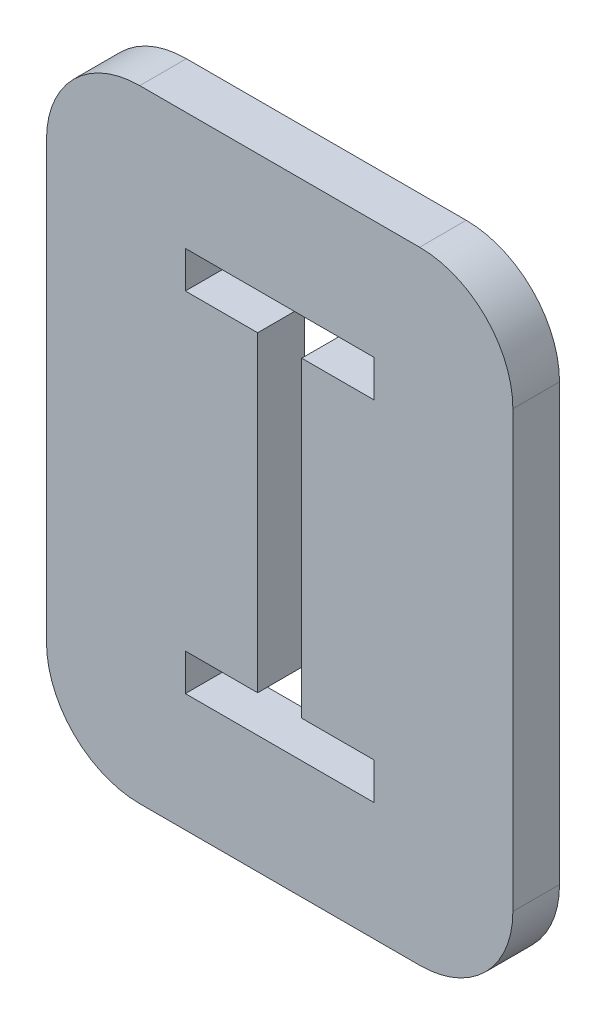
ISO-10303-21;
HEADER;
FILE_DESCRIPTION(('STEP AP214'),'2;1');
FILE_NAME('part.step','',(''),(''),'','','');
FILE_SCHEMA(('AUTOMOTIVE_DESIGN { 1 0 10303 214 1 1 1 1 }'));
ENDSEC;
DATA;
#1=APPLICATION_CONTEXT('core data for automotive mechanical design processes');
#2=APPLICATION_PROTOCOL_DEFINITION('international standard','automotive_design',2000,#1);
#3=PRODUCT_CONTEXT('',#1,'mechanical');
#4=PRODUCT('Part','Part','',(#3));
#5=PRODUCT_RELATED_PRODUCT_CATEGORY('part','',(#4));
#6=PRODUCT_DEFINITION_FORMATION('','',#4);
#7=PRODUCT_DEFINITION_CONTEXT('part definition',#1,'design');
#8=PRODUCT_DEFINITION('design','',#6,#7);
#9=PRODUCT_DEFINITION_SHAPE('','',#8);
#10=(LENGTH_UNIT() NAMED_UNIT(*) SI_UNIT(.MILLI.,.METRE.));
#11=(NAMED_UNIT(*) PLANE_ANGLE_UNIT() SI_UNIT($,.RADIAN.));
#12=(NAMED_UNIT(*) SI_UNIT($,.STERADIAN.) SOLID_ANGLE_UNIT());
#13=UNCERTAINTY_MEASURE_WITH_UNIT(LENGTH_MEASURE(1.E-05),#10,'distance_accuracy_value','');
#14=(GEOMETRIC_REPRESENTATION_CONTEXT(3) GLOBAL_UNCERTAINTY_ASSIGNED_CONTEXT((#13)) GLOBAL_UNIT_ASSIGNED_CONTEXT((#10,
#11,#12)) REPRESENTATION_CONTEXT('',''));
#15=CARTESIAN_POINT('',(0.,0.,0.));
#16=DIRECTION('',(0.,0.,1.));
#17=DIRECTION('',(1.,0.,0.));
#18=AXIS2_PLACEMENT_3D('',#15,#16,#17);
#19=CARTESIAN_POINT('',(-5.715,-8.89000000000002,0.9525));
#20=DIRECTION('',(0.,0.,-1.));
#21=DIRECTION('',(-1.,0.,0.));
#22=AXIS2_PLACEMENT_3D('',#19,#20,#21);
#23=PLANE('',#22);
#24=CARTESIAN_POINT('',(-5.715,-8.89000000000002,0.9525));
#25=DIRECTION('',(0.,0.,1.));
#26=DIRECTION('',(-1.,0.,0.));
#27=AXIS2_PLACEMENT_3D('',#24,#25,#26);
#28=CIRCLE('',#27,3.81);
#29=CARTESIAN_POINT('',(-9.525,-8.88999999999999,0.9525));
#30=VERTEX_POINT('',#29);
#31=CARTESIAN_POINT('',(-5.71499999999997,-12.7,0.9525));
#32=VERTEX_POINT('',#31);
#33=EDGE_CURVE('E265',#30,#32,#28,.T.);
#34=ORIENTED_EDGE('',*,*,#33,.T.);
#35=DIRECTION('',(1.,0.,0.));
#36=VECTOR('',#35,1.);
#37=CARTESIAN_POINT('',(-5.71499999999997,-12.7,0.9525));
#38=LINE('',#37,#36);
#39=CARTESIAN_POINT('',(5.71499999999997,-12.7,0.9525));
#40=VERTEX_POINT('',#39);
#41=EDGE_CURVE('E268',#32,#40,#38,.T.);
#42=ORIENTED_EDGE('',*,*,#41,.T.);
#43=CARTESIAN_POINT('',(5.715,-8.89000000000002,0.9525));
#44=DIRECTION('',(0.,0.,1.));
#45=DIRECTION('',(1.,0.,0.));
#46=AXIS2_PLACEMENT_3D('',#43,#44,#45);
#47=CIRCLE('',#46,3.81);
#48=CARTESIAN_POINT('',(9.525,-8.88999999999999,0.9525));
#49=VERTEX_POINT('',#48);
#50=EDGE_CURVE('E271',#40,#49,#47,.T.);
#51=ORIENTED_EDGE('',*,*,#50,.T.);
#52=DIRECTION('',(0.,1.,0.));
#53=VECTOR('',#52,1.);
#54=CARTESIAN_POINT('',(9.525,8.88999999999995,0.9525));
#55=LINE('',#54,#53);
#56=CARTESIAN_POINT('',(9.525,8.88999999999995,0.9525));
#57=VERTEX_POINT('',#56);
#58=EDGE_CURVE('E273',#49,#57,#55,.T.);
#59=ORIENTED_EDGE('',*,*,#58,.T.);
#60=CARTESIAN_POINT('',(5.71499999999999,8.88999999999998,0.9525));
#61=DIRECTION('',(0.,0.,1.));
#62=DIRECTION('',(1.,0.,0.));
#63=AXIS2_PLACEMENT_3D('',#60,#61,#62);
#64=CIRCLE('',#63,3.81);
#65=CARTESIAN_POINT('',(5.71499999999997,12.7,0.9525));
#66=VERTEX_POINT('',#65);
#67=EDGE_CURVE('E275',#57,#66,#64,.T.);
#68=ORIENTED_EDGE('',*,*,#67,.T.);
#69=DIRECTION('',(-1.,0.,0.));
#70=VECTOR('',#69,1.);
#71=CARTESIAN_POINT('',(-5.71499999999998,12.7,0.9525));
#72=LINE('',#71,#70);
#73=CARTESIAN_POINT('',(-5.71499999999998,12.7,0.9525));
#74=VERTEX_POINT('',#73);
#75=EDGE_CURVE('E277',#66,#74,#72,.T.);
#76=ORIENTED_EDGE('',*,*,#75,.T.);
#77=CARTESIAN_POINT('',(-5.71500000000001,8.88999999999998,0.9525));
#78=DIRECTION('',(0.,0.,1.));
#79=DIRECTION('',(-1.,0.,0.));
#80=AXIS2_PLACEMENT_3D('',#77,#78,#79);
#81=CIRCLE('',#80,3.81);
#82=CARTESIAN_POINT('',(-9.52500000000001,8.88999999999995,0.9525));
#83=VERTEX_POINT('',#82);
#84=EDGE_CURVE('E279',#74,#83,#81,.T.);
#85=ORIENTED_EDGE('',*,*,#84,.T.);
#86=DIRECTION('',(0.,-1.,0.));
#87=VECTOR('',#86,1.);
#88=CARTESIAN_POINT('',(-9.52500000000001,8.88999999999995,0.9525));
#89=LINE('',#88,#87);
#90=EDGE_CURVE('E281',#83,#30,#89,.T.);
#91=ORIENTED_EDGE('',*,*,#90,.T.);
#92=EDGE_LOOP('',(#34,#42,#51,#59,#68,#76,#85,#91));
#93=FACE_BOUND('',#92,.T.);
#94=DIRECTION('',(0.,-1.,0.));
#95=VECTOR('',#94,1.);
#96=CARTESIAN_POINT('',(-0.899999999999994,6.36729223871625,0.9525));
#97=LINE('',#96,#95);
#98=CARTESIAN_POINT('',(-0.899999999999994,6.36729223871625,0.9525));
#99=VERTEX_POINT('',#98);
#100=CARTESIAN_POINT('',(-0.89999999999999,-6.36729223871629,0.9525));
#101=VERTEX_POINT('',#100);
#102=EDGE_CURVE('E172',#99,#101,#97,.T.);
#103=ORIENTED_EDGE('',*,*,#102,.F.);
#104=DIRECTION('',(1.,0.,0.));
#105=VECTOR('',#104,1.);
#106=CARTESIAN_POINT('',(-3.85275000000001,6.36729223871625,0.9525));
#107=LINE('',#106,#105);
#108=CARTESIAN_POINT('',(-3.85275000000001,6.36729223871625,0.9525));
#109=VERTEX_POINT('',#108);
#110=EDGE_CURVE('E213',#109,#99,#107,.T.);
#111=ORIENTED_EDGE('',*,*,#110,.F.);
#112=DIRECTION('',(0.,-1.,0.));
#113=VECTOR('',#112,1.);
#114=CARTESIAN_POINT('',(-3.85275000000001,7.87399999999998,0.9525));
#115=LINE('',#114,#113);
#116=CARTESIAN_POINT('',(-3.85275000000001,7.87399999999998,0.9525));
#117=VERTEX_POINT('',#116);
#118=EDGE_CURVE('E211',#117,#109,#115,.T.);
#119=ORIENTED_EDGE('',*,*,#118,.F.);
#120=DIRECTION('',(-1.,0.,0.));
#121=VECTOR('',#120,1.);
#122=CARTESIAN_POINT('',(-3.85275000000001,7.87399999999998,0.9525));
#123=LINE('',#122,#121);
#124=CARTESIAN_POINT('',(3.85274999999999,7.87399999999998,0.9525));
#125=VERTEX_POINT('',#124);
#126=EDGE_CURVE('E209',#125,#117,#123,.T.);
#127=ORIENTED_EDGE('',*,*,#126,.F.);
#128=DIRECTION('',(0.,1.,0.));
#129=VECTOR('',#128,1.);
#130=CARTESIAN_POINT('',(3.85274999999999,7.87399999999998,0.9525));
#131=LINE('',#130,#129);
#132=CARTESIAN_POINT('',(3.85274999999999,6.36729223871625,0.9525));
#133=VERTEX_POINT('',#132);
#134=EDGE_CURVE('E207',#133,#125,#131,.T.);
#135=ORIENTED_EDGE('',*,*,#134,.F.);
#136=DIRECTION('',(1.,0.,0.));
#137=VECTOR('',#136,1.);
#138=CARTESIAN_POINT('',(3.85274999999999,6.36729223871625,0.9525));
#139=LINE('',#138,#137);
#140=CARTESIAN_POINT('',(0.900000000000006,6.36729223871625,0.9525));
#141=VERTEX_POINT('',#140);
#142=EDGE_CURVE('E205',#141,#133,#139,.T.);
#143=ORIENTED_EDGE('',*,*,#142,.F.);
#144=DIRECTION('',(0.,1.,0.));
#145=VECTOR('',#144,1.);
#146=CARTESIAN_POINT('',(0.900000000000006,6.36729223871625,0.9525));
#147=LINE('',#146,#145);
#148=CARTESIAN_POINT('',(0.90000000000001,-6.36729223871629,0.9525));
#149=VERTEX_POINT('',#148);
#150=EDGE_CURVE('E203',#149,#141,#147,.T.);
#151=ORIENTED_EDGE('',*,*,#150,.F.);
#152=DIRECTION('',(-1.,0.,0.));
#153=VECTOR('',#152,1.);
#154=CARTESIAN_POINT('',(3.85274999999999,-6.36729223871629,0.9525));
#155=LINE('',#154,#153);
#156=CARTESIAN_POINT('',(3.85274999999999,-6.36729223871629,0.9525));
#157=VERTEX_POINT('',#156);
#158=EDGE_CURVE('E201',#157,#149,#155,.T.);
#159=ORIENTED_EDGE('',*,*,#158,.F.);
#160=DIRECTION('',(0.,1.,0.));
#161=VECTOR('',#160,1.);
#162=CARTESIAN_POINT('',(3.85274999999999,-6.36729223871629,0.9525));
#163=LINE('',#162,#161);
#164=CARTESIAN_POINT('',(3.85275,-7.87400000000002,0.9525));
#165=VERTEX_POINT('',#164);
#166=EDGE_CURVE('E199',#165,#157,#163,.T.);
#167=ORIENTED_EDGE('',*,*,#166,.F.);
#168=DIRECTION('',(1.,0.,0.));
#169=VECTOR('',#168,1.);
#170=CARTESIAN_POINT('',(-3.85275,-7.87400000000002,0.9525));
#171=LINE('',#170,#169);
#172=CARTESIAN_POINT('',(-3.85275,-7.87400000000002,0.9525));
#173=VERTEX_POINT('',#172);
#174=EDGE_CURVE('E195',#173,#165,#171,.T.);
#175=ORIENTED_EDGE('',*,*,#174,.F.);
#176=DIRECTION('',(0.,-1.,0.));
#177=VECTOR('',#176,1.);
#178=CARTESIAN_POINT('',(-3.85275,-6.36729223871629,0.9525));
#179=LINE('',#178,#177);
#180=CARTESIAN_POINT('',(-3.85275,-6.36729223871629,0.9525));
#181=VERTEX_POINT('',#180);
#182=EDGE_CURVE('E193',#181,#173,#179,.T.);
#183=ORIENTED_EDGE('',*,*,#182,.F.);
#184=DIRECTION('',(-1.,0.,0.));
#185=VECTOR('',#184,1.);
#186=CARTESIAN_POINT('',(-3.85275,-6.36729223871629,0.9525));
#187=LINE('',#186,#185);
#188=EDGE_CURVE('E180',#101,#181,#187,.T.);
#189=ORIENTED_EDGE('',*,*,#188,.F.);
#190=EDGE_LOOP('',(#103,#111,#119,#127,#135,#143,#151,#159,#167,#175,#183,#189));
#191=FACE_BOUND('',#190,.T.);
#192=ADVANCED_FACE('F35',(#93,#191),#23,.F.);
#193=CARTESIAN_POINT('',(-5.715,-8.89000000000002,-0.9525));
#194=DIRECTION('',(0.,0.,-1.));
#195=DIRECTION('',(-1.,0.,0.));
#196=AXIS2_PLACEMENT_3D('',#193,#194,#195);
#197=PLANE('',#196);
#198=CARTESIAN_POINT('',(-5.715,-8.89000000000002,-0.9525));
#199=DIRECTION('',(0.,0.,1.));
#200=DIRECTION('',(-1.,0.,0.));
#201=AXIS2_PLACEMENT_3D('',#198,#199,#200);
#202=CIRCLE('',#201,3.81);
#203=CARTESIAN_POINT('',(-9.525,-8.88999999999999,-0.9525));
#204=VERTEX_POINT('',#203);
#205=CARTESIAN_POINT('',(-5.71499999999997,-12.7,-0.9525));
#206=VERTEX_POINT('',#205);
#207=EDGE_CURVE('E188',#204,#206,#202,.T.);
#208=ORIENTED_EDGE('',*,*,#207,.F.);
#209=DIRECTION('',(0.,-1.,0.));
#210=VECTOR('',#209,1.);
#211=CARTESIAN_POINT('',(-9.52500000000001,8.88999999999995,-0.9525));
#212=LINE('',#211,#210);
#213=CARTESIAN_POINT('',(-9.52500000000001,8.88999999999995,-0.9525));
#214=VERTEX_POINT('',#213);
#215=EDGE_CURVE('E269',#214,#204,#212,.T.);
#216=ORIENTED_EDGE('',*,*,#215,.F.);
#217=CARTESIAN_POINT('',(-5.71500000000001,8.88999999999998,-0.9525));
#218=DIRECTION('',(0.,0.,1.));
#219=DIRECTION('',(-1.,0.,0.));
#220=AXIS2_PLACEMENT_3D('',#217,#218,#219);
#221=CIRCLE('',#220,3.81);
#222=CARTESIAN_POINT('',(-5.71499999999998,12.7,-0.9525));
#223=VERTEX_POINT('',#222);
#224=EDGE_CURVE('E296',#223,#214,#221,.T.);
#225=ORIENTED_EDGE('',*,*,#224,.F.);
#226=DIRECTION('',(-1.,0.,0.));
#227=VECTOR('',#226,1.);
#228=CARTESIAN_POINT('',(-5.71499999999998,12.7,-0.9525));
#229=LINE('',#228,#227);
#230=CARTESIAN_POINT('',(5.71499999999997,12.7,-0.9525));
#231=VERTEX_POINT('',#230);
#232=EDGE_CURVE('E294',#231,#223,#229,.T.);
#233=ORIENTED_EDGE('',*,*,#232,.F.);
#234=CARTESIAN_POINT('',(5.71499999999999,8.88999999999998,-0.9525));
#235=DIRECTION('',(0.,0.,1.));
#236=DIRECTION('',(1.,0.,0.));
#237=AXIS2_PLACEMENT_3D('',#234,#235,#236);
#238=CIRCLE('',#237,3.81);
#239=CARTESIAN_POINT('',(9.525,8.88999999999995,-0.9525));
#240=VERTEX_POINT('',#239);
#241=EDGE_CURVE('E292',#240,#231,#238,.T.);
#242=ORIENTED_EDGE('',*,*,#241,.F.);
#243=DIRECTION('',(0.,1.,0.));
#244=VECTOR('',#243,1.);
#245=CARTESIAN_POINT('',(9.525,8.88999999999995,-0.9525));
#246=LINE('',#245,#244);
#247=CARTESIAN_POINT('',(9.525,-8.88999999999999,-0.9525));
#248=VERTEX_POINT('',#247);
#249=EDGE_CURVE('E290',#248,#240,#246,.T.);
#250=ORIENTED_EDGE('',*,*,#249,.F.);
#251=CARTESIAN_POINT('',(5.715,-8.89000000000002,-0.9525));
#252=DIRECTION('',(0.,0.,1.));
#253=DIRECTION('',(1.,0.,0.));
#254=AXIS2_PLACEMENT_3D('',#251,#252,#253);
#255=CIRCLE('',#254,3.81);
#256=CARTESIAN_POINT('',(5.71499999999997,-12.7,-0.9525));
#257=VERTEX_POINT('',#256);
#258=EDGE_CURVE('E288',#257,#248,#255,.T.);
#259=ORIENTED_EDGE('',*,*,#258,.F.);
#260=DIRECTION('',(1.,0.,0.));
#261=VECTOR('',#260,1.);
#262=CARTESIAN_POINT('',(-5.71499999999997,-12.7,-0.9525));
#263=LINE('',#262,#261);
#264=EDGE_CURVE('E286',#206,#257,#263,.T.);
#265=ORIENTED_EDGE('',*,*,#264,.F.);
#266=EDGE_LOOP('',(#208,#216,#225,#233,#242,#250,#259,#265));
#267=FACE_BOUND('',#266,.T.);
#268=DIRECTION('',(1.,0.,0.));
#269=VECTOR('',#268,1.);
#270=CARTESIAN_POINT('',(-3.85275000000001,6.36729223871625,-0.9525));
#271=LINE('',#270,#269);
#272=CARTESIAN_POINT('',(-3.85275000000001,6.36729223871625,-0.9525));
#273=VERTEX_POINT('',#272);
#274=CARTESIAN_POINT('',(-0.899999999999994,6.36729223871625,-0.9525));
#275=VERTEX_POINT('',#274);
#276=EDGE_CURVE('E181',#273,#275,#271,.T.);
#277=ORIENTED_EDGE('',*,*,#276,.T.);
#278=DIRECTION('',(0.,-1.,0.));
#279=VECTOR('',#278,1.);
#280=CARTESIAN_POINT('',(-0.899999999999994,6.36729223871625,-0.9525));
#281=LINE('',#280,#279);
#282=CARTESIAN_POINT('',(-0.89999999999999,-6.36729223871629,-0.9525));
#283=VERTEX_POINT('',#282);
#284=EDGE_CURVE('E58',#275,#283,#281,.T.);
#285=ORIENTED_EDGE('',*,*,#284,.T.);
#286=DIRECTION('',(-1.,0.,0.));
#287=VECTOR('',#286,1.);
#288=CARTESIAN_POINT('',(-3.85275,-6.36729223871629,-0.9525));
#289=LINE('',#288,#287);
#290=CARTESIAN_POINT('',(-3.85275,-6.36729223871629,-0.9525));
#291=VERTEX_POINT('',#290);
#292=EDGE_CURVE('E187',#283,#291,#289,.T.);
#293=ORIENTED_EDGE('',*,*,#292,.T.);
#294=DIRECTION('',(0.,-1.,0.));
#295=VECTOR('',#294,1.);
#296=CARTESIAN_POINT('',(-3.85275,-6.36729223871629,-0.9525));
#297=LINE('',#296,#295);
#298=CARTESIAN_POINT('',(-3.85275,-7.87400000000002,-0.9525));
#299=VERTEX_POINT('',#298);
#300=EDGE_CURVE('E217',#291,#299,#297,.T.);
#301=ORIENTED_EDGE('',*,*,#300,.T.);
#302=DIRECTION('',(1.,0.,0.));
#303=VECTOR('',#302,1.);
#304=CARTESIAN_POINT('',(-3.85275,-7.87400000000002,-0.9525));
#305=LINE('',#304,#303);
#306=CARTESIAN_POINT('',(3.85275,-7.87400000000002,-0.9525));
#307=VERTEX_POINT('',#306);
#308=EDGE_CURVE('E220',#299,#307,#305,.T.);
#309=ORIENTED_EDGE('',*,*,#308,.T.);
#310=DIRECTION('',(0.,1.,0.));
#311=VECTOR('',#310,1.);
#312=CARTESIAN_POINT('',(3.85274999999999,-6.36729223871629,-0.9525));
#313=LINE('',#312,#311);
#314=CARTESIAN_POINT('',(3.85274999999999,-6.36729223871629,-0.9525));
#315=VERTEX_POINT('',#314);
#316=EDGE_CURVE('E223',#307,#315,#313,.T.);
#317=ORIENTED_EDGE('',*,*,#316,.T.);
#318=DIRECTION('',(-1.,0.,0.));
#319=VECTOR('',#318,1.);
#320=CARTESIAN_POINT('',(3.85274999999999,-6.36729223871629,-0.9525));
#321=LINE('',#320,#319);
#322=CARTESIAN_POINT('',(0.90000000000001,-6.36729223871629,-0.9525));
#323=VERTEX_POINT('',#322);
#324=EDGE_CURVE('E226',#315,#323,#321,.T.);
#325=ORIENTED_EDGE('',*,*,#324,.T.);
#326=DIRECTION('',(0.,1.,0.));
#327=VECTOR('',#326,1.);
#328=CARTESIAN_POINT('',(0.900000000000006,6.36729223871625,-0.9525));
#329=LINE('',#328,#327);
#330=CARTESIAN_POINT('',(0.900000000000006,6.36729223871625,-0.9525));
#331=VERTEX_POINT('',#330);
#332=EDGE_CURVE('E229',#323,#331,#329,.T.);
#333=ORIENTED_EDGE('',*,*,#332,.T.);
#334=DIRECTION('',(1.,0.,0.));
#335=VECTOR('',#334,1.);
#336=CARTESIAN_POINT('',(3.85274999999999,6.36729223871625,-0.9525));
#337=LINE('',#336,#335);
#338=CARTESIAN_POINT('',(3.85274999999999,6.36729223871625,-0.9525));
#339=VERTEX_POINT('',#338);
#340=EDGE_CURVE('E232',#331,#339,#337,.T.);
#341=ORIENTED_EDGE('',*,*,#340,.T.);
#342=DIRECTION('',(0.,1.,0.));
#343=VECTOR('',#342,1.);
#344=CARTESIAN_POINT('',(3.85274999999999,7.87399999999998,-0.9525));
#345=LINE('',#344,#343);
#346=CARTESIAN_POINT('',(3.85274999999999,7.87399999999998,-0.9525));
#347=VERTEX_POINT('',#346);
#348=EDGE_CURVE('E235',#339,#347,#345,.T.);
#349=ORIENTED_EDGE('',*,*,#348,.T.);
#350=DIRECTION('',(-1.,0.,0.));
#351=VECTOR('',#350,1.);
#352=CARTESIAN_POINT('',(-3.85275000000001,7.87399999999998,-0.9525));
#353=LINE('',#352,#351);
#354=CARTESIAN_POINT('',(-3.85275000000001,7.87399999999998,-0.9525));
#355=VERTEX_POINT('',#354);
#356=EDGE_CURVE('E238',#347,#355,#353,.T.);
#357=ORIENTED_EDGE('',*,*,#356,.T.);
#358=DIRECTION('',(0.,-1.,0.));
#359=VECTOR('',#358,1.);
#360=CARTESIAN_POINT('',(-3.85275000000001,7.87399999999998,-0.9525));
#361=LINE('',#360,#359);
#362=EDGE_CURVE('E241',#355,#273,#361,.T.);
#363=ORIENTED_EDGE('',*,*,#362,.T.);
#364=EDGE_LOOP('',(#277,#285,#293,#301,#309,#317,#325,#333,#341,#349,#357,#363));
#365=FACE_BOUND('',#364,.T.);
#366=ADVANCED_FACE('F326',(#267,#365),#197,.T.);
#367=CARTESIAN_POINT('',(-5.715,-8.89000000000002,0.9525));
#368=DIRECTION('',(0.,0.,-1.));
#369=DIRECTION('',(-1.,0.,0.));
#370=AXIS2_PLACEMENT_3D('',#367,#368,#369);
#371=CYLINDRICAL_SURFACE('',#370,3.81);
#372=ORIENTED_EDGE('',*,*,#207,.T.);
#373=DIRECTION('',(0.,0.,-1.));
#374=VECTOR('',#373,1.);
#375=CARTESIAN_POINT('',(-5.71499999999997,-12.7,0.9525));
#376=LINE('',#375,#374);
#377=EDGE_CURVE('E11',#32,#206,#376,.T.);
#378=ORIENTED_EDGE('',*,*,#377,.F.);
#379=ORIENTED_EDGE('',*,*,#33,.F.);
#380=DIRECTION('',(0.,0.,-1.));
#381=VECTOR('',#380,1.);
#382=CARTESIAN_POINT('',(-9.525,-8.88999999999999,0.9525));
#383=LINE('',#382,#381);
#384=EDGE_CURVE('E283',#30,#204,#383,.T.);
#385=ORIENTED_EDGE('',*,*,#384,.T.);
#386=EDGE_LOOP('',(#372,#378,#379,#385));
#387=FACE_BOUND('',#386,.T.);
#388=ADVANCED_FACE('F37',(#387),#371,.T.);
#389=CARTESIAN_POINT('',(-5.71499999999997,-12.7,0.9525));
#390=DIRECTION('',(0.,1.,0.));
#391=DIRECTION('',(0.,0.,1.));
#392=AXIS2_PLACEMENT_3D('',#389,#390,#391);
#393=PLANE('',#392);
#394=ORIENTED_EDGE('',*,*,#264,.T.);
#395=DIRECTION('',(0.,0.,-1.));
#396=VECTOR('',#395,1.);
#397=CARTESIAN_POINT('',(5.71499999999997,-12.7,0.9525));
#398=LINE('',#397,#396);
#399=EDGE_CURVE('E43',#40,#257,#398,.T.);
#400=ORIENTED_EDGE('',*,*,#399,.F.);
#401=ORIENTED_EDGE('',*,*,#41,.F.);
#402=ORIENTED_EDGE('',*,*,#377,.T.);
#403=EDGE_LOOP('',(#394,#400,#401,#402));
#404=FACE_BOUND('',#403,.T.);
#405=ADVANCED_FACE('F343',(#404),#393,.F.);
#406=CARTESIAN_POINT('',(5.715,-8.89000000000002,0.9525));
#407=DIRECTION('',(0.,0.,-1.));
#408=DIRECTION('',(-1.,0.,0.));
#409=AXIS2_PLACEMENT_3D('',#406,#407,#408);
#410=CYLINDRICAL_SURFACE('',#409,3.81);
#411=ORIENTED_EDGE('',*,*,#258,.T.);
#412=DIRECTION('',(0.,0.,-1.));
#413=VECTOR('',#412,1.);
#414=CARTESIAN_POINT('',(9.525,-8.88999999999999,0.9525));
#415=LINE('',#414,#413);
#416=EDGE_CURVE('E313',#49,#248,#415,.T.);
#417=ORIENTED_EDGE('',*,*,#416,.F.);
#418=ORIENTED_EDGE('',*,*,#50,.F.);
#419=ORIENTED_EDGE('',*,*,#399,.T.);
#420=EDGE_LOOP('',(#411,#417,#418,#419));
#421=FACE_BOUND('',#420,.T.);
#422=ADVANCED_FACE('F320',(#421),#410,.T.);
#423=CARTESIAN_POINT('',(9.525,8.88999999999995,0.9525));
#424=DIRECTION('',(-1.,0.,0.));
#425=DIRECTION('',(0.,-1.,0.));
#426=AXIS2_PLACEMENT_3D('',#423,#424,#425);
#427=PLANE('',#426);
#428=ORIENTED_EDGE('',*,*,#249,.T.);
#429=DIRECTION('',(0.,0.,-1.));
#430=VECTOR('',#429,1.);
#431=CARTESIAN_POINT('',(9.525,8.88999999999995,0.9525));
#432=LINE('',#431,#430);
#433=EDGE_CURVE('E310',#57,#240,#432,.T.);
#434=ORIENTED_EDGE('',*,*,#433,.F.);
#435=ORIENTED_EDGE('',*,*,#58,.F.);
#436=ORIENTED_EDGE('',*,*,#416,.T.);
#437=EDGE_LOOP('',(#428,#434,#435,#436));
#438=FACE_BOUND('',#437,.T.);
#439=ADVANCED_FACE('F332',(#438),#427,.F.);
#440=CARTESIAN_POINT('',(5.71499999999999,8.88999999999998,0.9525));
#441=DIRECTION('',(0.,0.,-1.));
#442=DIRECTION('',(-1.,0.,0.));
#443=AXIS2_PLACEMENT_3D('',#440,#441,#442);
#444=CYLINDRICAL_SURFACE('',#443,3.81);
#445=ORIENTED_EDGE('',*,*,#241,.T.);
#446=DIRECTION('',(0.,0.,-1.));
#447=VECTOR('',#446,1.);
#448=CARTESIAN_POINT('',(5.71499999999997,12.7,0.9525));
#449=LINE('',#448,#447);
#450=EDGE_CURVE('E307',#66,#231,#449,.T.);
#451=ORIENTED_EDGE('',*,*,#450,.F.);
#452=ORIENTED_EDGE('',*,*,#67,.F.);
#453=ORIENTED_EDGE('',*,*,#433,.T.);
#454=EDGE_LOOP('',(#445,#451,#452,#453));
#455=FACE_BOUND('',#454,.T.);
#456=ADVANCED_FACE('F336',(#455),#444,.T.);
#457=CARTESIAN_POINT('',(-5.71499999999998,12.7,0.9525));
#458=DIRECTION('',(0.,-1.,0.));
#459=DIRECTION('',(0.,0.,-1.));
#460=AXIS2_PLACEMENT_3D('',#457,#458,#459);
#461=PLANE('',#460);
#462=ORIENTED_EDGE('',*,*,#232,.T.);
#463=DIRECTION('',(0.,0.,-1.));
#464=VECTOR('',#463,1.);
#465=CARTESIAN_POINT('',(-5.71499999999998,12.7,0.9525));
#466=LINE('',#465,#464);
#467=EDGE_CURVE('E304',#74,#223,#466,.T.);
#468=ORIENTED_EDGE('',*,*,#467,.F.);
#469=ORIENTED_EDGE('',*,*,#75,.F.);
#470=ORIENTED_EDGE('',*,*,#450,.T.);
#471=EDGE_LOOP('',(#462,#468,#469,#470));
#472=FACE_BOUND('',#471,.T.);
#473=ADVANCED_FACE('F356',(#472),#461,.F.);
#474=CARTESIAN_POINT('',(-5.71500000000001,8.88999999999998,0.9525));
#475=DIRECTION('',(0.,0.,-1.));
#476=DIRECTION('',(-1.,0.,0.));
#477=AXIS2_PLACEMENT_3D('',#474,#475,#476);
#478=CYLINDRICAL_SURFACE('',#477,3.81);
#479=ORIENTED_EDGE('',*,*,#224,.T.);
#480=DIRECTION('',(0.,0.,-1.));
#481=VECTOR('',#480,1.);
#482=CARTESIAN_POINT('',(-9.52500000000001,8.88999999999995,0.9525));
#483=LINE('',#482,#481);
#484=EDGE_CURVE('E301',#83,#214,#483,.T.);
#485=ORIENTED_EDGE('',*,*,#484,.F.);
#486=ORIENTED_EDGE('',*,*,#84,.F.);
#487=ORIENTED_EDGE('',*,*,#467,.T.);
#488=EDGE_LOOP('',(#479,#485,#486,#487));
#489=FACE_BOUND('',#488,.T.);
#490=ADVANCED_FACE('F354',(#489),#478,.T.);
#491=CARTESIAN_POINT('',(-9.52500000000001,8.88999999999995,0.9525));
#492=DIRECTION('',(1.,0.,0.));
#493=DIRECTION('',(0.,1.,0.));
#494=AXIS2_PLACEMENT_3D('',#491,#492,#493);
#495=PLANE('',#494);
#496=ORIENTED_EDGE('',*,*,#215,.T.);
#497=ORIENTED_EDGE('',*,*,#384,.F.);
#498=ORIENTED_EDGE('',*,*,#90,.F.);
#499=ORIENTED_EDGE('',*,*,#484,.T.);
#500=EDGE_LOOP('',(#496,#497,#498,#499));
#501=FACE_BOUND('',#500,.T.);
#502=ADVANCED_FACE('F349',(#501),#495,.F.);
#503=CARTESIAN_POINT('',(-0.899999999999994,6.36729223871625,0.9525));
#504=DIRECTION('',(1.,0.,0.));
#505=DIRECTION('',(0.,1.,0.));
#506=AXIS2_PLACEMENT_3D('',#503,#504,#505);
#507=PLANE('',#506);
#508=ORIENTED_EDGE('',*,*,#284,.F.);
#509=DIRECTION('',(0.,0.,-1.));
#510=VECTOR('',#509,1.);
#511=CARTESIAN_POINT('',(-0.899999999999994,6.36729223871625,0.9525));
#512=LINE('',#511,#510);
#513=EDGE_CURVE('E176',#99,#275,#512,.T.);
#514=ORIENTED_EDGE('',*,*,#513,.F.);
#515=ORIENTED_EDGE('',*,*,#102,.T.);
#516=DIRECTION('',(0.,0.,-1.));
#517=VECTOR('',#516,1.);
#518=CARTESIAN_POINT('',(-0.89999999999999,-6.36729223871629,0.9525));
#519=LINE('',#518,#517);
#520=EDGE_CURVE('E175',#101,#283,#519,.T.);
#521=ORIENTED_EDGE('',*,*,#520,.T.);
#522=EDGE_LOOP('',(#508,#514,#515,#521));
#523=FACE_BOUND('',#522,.T.);
#524=ADVANCED_FACE('F174',(#523),#507,.T.);
#525=CARTESIAN_POINT('',(-3.85275,-6.36729223871629,0.9525));
#526=DIRECTION('',(0.,-1.,0.));
#527=DIRECTION('',(0.,0.,-1.));
#528=AXIS2_PLACEMENT_3D('',#525,#526,#527);
#529=PLANE('',#528);
#530=ORIENTED_EDGE('',*,*,#292,.F.);
#531=ORIENTED_EDGE('',*,*,#520,.F.);
#532=ORIENTED_EDGE('',*,*,#188,.T.);
#533=DIRECTION('',(0.,0.,-1.));
#534=VECTOR('',#533,1.);
#535=CARTESIAN_POINT('',(-3.85275,-6.36729223871629,0.9525));
#536=LINE('',#535,#534);
#537=EDGE_CURVE('E189',#181,#291,#536,.T.);
#538=ORIENTED_EDGE('',*,*,#537,.T.);
#539=EDGE_LOOP('',(#530,#531,#532,#538));
#540=FACE_BOUND('',#539,.T.);
#541=ADVANCED_FACE('F184',(#540),#529,.T.);
#542=CARTESIAN_POINT('',(-3.85275,-6.36729223871629,0.9525));
#543=DIRECTION('',(1.,0.,0.));
#544=DIRECTION('',(0.,1.,0.));
#545=AXIS2_PLACEMENT_3D('',#542,#543,#544);
#546=PLANE('',#545);
#547=ORIENTED_EDGE('',*,*,#300,.F.);
#548=ORIENTED_EDGE('',*,*,#537,.F.);
#549=ORIENTED_EDGE('',*,*,#182,.T.);
#550=DIRECTION('',(0.,0.,-1.));
#551=VECTOR('',#550,1.);
#552=CARTESIAN_POINT('',(-3.85275,-7.87400000000002,0.9525));
#553=LINE('',#552,#551);
#554=EDGE_CURVE('E262',#173,#299,#553,.T.);
#555=ORIENTED_EDGE('',*,*,#554,.T.);
#556=EDGE_LOOP('',(#547,#548,#549,#555));
#557=FACE_BOUND('',#556,.T.);
#558=ADVANCED_FACE('F381',(#557),#546,.T.);
#559=CARTESIAN_POINT('',(-3.85275,-7.87400000000002,0.9525));
#560=DIRECTION('',(0.,1.,0.));
#561=DIRECTION('',(0.,0.,1.));
#562=AXIS2_PLACEMENT_3D('',#559,#560,#561);
#563=PLANE('',#562);
#564=ORIENTED_EDGE('',*,*,#308,.F.);
#565=ORIENTED_EDGE('',*,*,#554,.F.);
#566=ORIENTED_EDGE('',*,*,#174,.T.);
#567=DIRECTION('',(0.,0.,-1.));
#568=VECTOR('',#567,1.);
#569=CARTESIAN_POINT('',(3.85275,-7.87400000000002,0.9525));
#570=LINE('',#569,#568);
#571=EDGE_CURVE('E260',#165,#307,#570,.T.);
#572=ORIENTED_EDGE('',*,*,#571,.T.);
#573=EDGE_LOOP('',(#564,#565,#566,#572));
#574=FACE_BOUND('',#573,.T.);
#575=ADVANCED_FACE('F385',(#574),#563,.T.);
#576=CARTESIAN_POINT('',(3.85274999999999,-6.36729223871629,0.9525));
#577=DIRECTION('',(-1.,0.,0.));
#578=DIRECTION('',(0.,-1.,0.));
#579=AXIS2_PLACEMENT_3D('',#576,#577,#578);
#580=PLANE('',#579);
#581=ORIENTED_EDGE('',*,*,#316,.F.);
#582=ORIENTED_EDGE('',*,*,#571,.F.);
#583=ORIENTED_EDGE('',*,*,#166,.T.);
#584=DIRECTION('',(0.,0.,-1.));
#585=VECTOR('',#584,1.);
#586=CARTESIAN_POINT('',(3.85274999999999,-6.36729223871629,0.9525));
#587=LINE('',#586,#585);
#588=EDGE_CURVE('E258',#157,#315,#587,.T.);
#589=ORIENTED_EDGE('',*,*,#588,.T.);
#590=EDGE_LOOP('',(#581,#582,#583,#589));
#591=FACE_BOUND('',#590,.T.);
#592=ADVANCED_FACE('F391',(#591),#580,.T.);
#593=CARTESIAN_POINT('',(3.85274999999999,-6.36729223871629,0.9525));
#594=DIRECTION('',(0.,-1.,0.));
#595=DIRECTION('',(0.,0.,-1.));
#596=AXIS2_PLACEMENT_3D('',#593,#594,#595);
#597=PLANE('',#596);
#598=ORIENTED_EDGE('',*,*,#324,.F.);
#599=ORIENTED_EDGE('',*,*,#588,.F.);
#600=ORIENTED_EDGE('',*,*,#158,.T.);
#601=DIRECTION('',(0.,0.,-1.));
#602=VECTOR('',#601,1.);
#603=CARTESIAN_POINT('',(0.90000000000001,-6.36729223871629,0.9525));
#604=LINE('',#603,#602);
#605=EDGE_CURVE('E256',#149,#323,#604,.T.);
#606=ORIENTED_EDGE('',*,*,#605,.T.);
#607=EDGE_LOOP('',(#598,#599,#600,#606));
#608=FACE_BOUND('',#607,.T.);
#609=ADVANCED_FACE('F395',(#608),#597,.T.);
#610=CARTESIAN_POINT('',(0.900000000000006,6.36729223871625,0.9525));
#611=DIRECTION('',(-1.,0.,0.));
#612=DIRECTION('',(0.,-1.,0.));
#613=AXIS2_PLACEMENT_3D('',#610,#611,#612);
#614=PLANE('',#613);
#615=ORIENTED_EDGE('',*,*,#332,.F.);
#616=ORIENTED_EDGE('',*,*,#605,.F.);
#617=ORIENTED_EDGE('',*,*,#150,.T.);
#618=DIRECTION('',(0.,0.,-1.));
#619=VECTOR('',#618,1.);
#620=CARTESIAN_POINT('',(0.900000000000006,6.36729223871625,0.9525));
#621=LINE('',#620,#619);
#622=EDGE_CURVE('E254',#141,#331,#621,.T.);
#623=ORIENTED_EDGE('',*,*,#622,.T.);
#624=EDGE_LOOP('',(#615,#616,#617,#623));
#625=FACE_BOUND('',#624,.T.);
#626=ADVANCED_FACE('F399',(#625),#614,.T.);
#627=CARTESIAN_POINT('',(3.85274999999999,6.36729223871625,0.9525));
#628=DIRECTION('',(0.,1.,0.));
#629=DIRECTION('',(0.,0.,1.));
#630=AXIS2_PLACEMENT_3D('',#627,#628,#629);
#631=PLANE('',#630);
#632=ORIENTED_EDGE('',*,*,#340,.F.);
#633=ORIENTED_EDGE('',*,*,#622,.F.);
#634=ORIENTED_EDGE('',*,*,#142,.T.);
#635=DIRECTION('',(0.,0.,-1.));
#636=VECTOR('',#635,1.);
#637=CARTESIAN_POINT('',(3.85274999999999,6.36729223871625,0.9525));
#638=LINE('',#637,#636);
#639=EDGE_CURVE('E252',#133,#339,#638,.T.);
#640=ORIENTED_EDGE('',*,*,#639,.T.);
#641=EDGE_LOOP('',(#632,#633,#634,#640));
#642=FACE_BOUND('',#641,.T.);
#643=ADVANCED_FACE('F403',(#642),#631,.T.);
#644=CARTESIAN_POINT('',(3.85274999999999,7.87399999999998,0.9525));
#645=DIRECTION('',(-1.,0.,0.));
#646=DIRECTION('',(0.,-1.,0.));
#647=AXIS2_PLACEMENT_3D('',#644,#645,#646);
#648=PLANE('',#647);
#649=ORIENTED_EDGE('',*,*,#348,.F.);
#650=ORIENTED_EDGE('',*,*,#639,.F.);
#651=ORIENTED_EDGE('',*,*,#134,.T.);
#652=DIRECTION('',(0.,0.,-1.));
#653=VECTOR('',#652,1.);
#654=CARTESIAN_POINT('',(3.85274999999999,7.87399999999998,0.9525));
#655=LINE('',#654,#653);
#656=EDGE_CURVE('E250',#125,#347,#655,.T.);
#657=ORIENTED_EDGE('',*,*,#656,.T.);
#658=EDGE_LOOP('',(#649,#650,#651,#657));
#659=FACE_BOUND('',#658,.T.);
#660=ADVANCED_FACE('F407',(#659),#648,.T.);
#661=CARTESIAN_POINT('',(-3.85275000000001,7.87399999999998,0.9525));
#662=DIRECTION('',(0.,-1.,0.));
#663=DIRECTION('',(0.,0.,-1.));
#664=AXIS2_PLACEMENT_3D('',#661,#662,#663);
#665=PLANE('',#664);
#666=ORIENTED_EDGE('',*,*,#356,.F.);
#667=ORIENTED_EDGE('',*,*,#656,.F.);
#668=ORIENTED_EDGE('',*,*,#126,.T.);
#669=DIRECTION('',(0.,0.,-1.));
#670=VECTOR('',#669,1.);
#671=CARTESIAN_POINT('',(-3.85275000000001,7.87399999999998,0.9525));
#672=LINE('',#671,#670);
#673=EDGE_CURVE('E248',#117,#355,#672,.T.);
#674=ORIENTED_EDGE('',*,*,#673,.T.);
#675=EDGE_LOOP('',(#666,#667,#668,#674));
#676=FACE_BOUND('',#675,.T.);
#677=ADVANCED_FACE('F411',(#676),#665,.T.);
#678=CARTESIAN_POINT('',(-3.85275000000001,7.87399999999998,0.9525));
#679=DIRECTION('',(1.,0.,0.));
#680=DIRECTION('',(0.,0.,-1.));
#681=AXIS2_PLACEMENT_3D('',#678,#679,#680);
#682=PLANE('',#681);
#683=ORIENTED_EDGE('',*,*,#362,.F.);
#684=ORIENTED_EDGE('',*,*,#673,.F.);
#685=ORIENTED_EDGE('',*,*,#118,.T.);
#686=DIRECTION('',(0.,0.,-1.));
#687=VECTOR('',#686,1.);
#688=CARTESIAN_POINT('',(-3.85275000000001,6.36729223871625,0.9525));
#689=LINE('',#688,#687);
#690=EDGE_CURVE('E50',#109,#273,#689,.T.);
#691=ORIENTED_EDGE('',*,*,#690,.T.);
#692=EDGE_LOOP('',(#683,#684,#685,#691));
#693=FACE_BOUND('',#692,.T.);
#694=ADVANCED_FACE('F415',(#693),#682,.T.);
#695=CARTESIAN_POINT('',(-3.85275000000001,6.36729223871625,0.9525));
#696=DIRECTION('',(0.,1.,0.));
#697=DIRECTION('',(0.,0.,1.));
#698=AXIS2_PLACEMENT_3D('',#695,#696,#697);
#699=PLANE('',#698);
#700=ORIENTED_EDGE('',*,*,#276,.F.);
#701=ORIENTED_EDGE('',*,*,#690,.F.);
#702=ORIENTED_EDGE('',*,*,#110,.T.);
#703=ORIENTED_EDGE('',*,*,#513,.T.);
#704=EDGE_LOOP('',(#700,#701,#702,#703));
#705=FACE_BOUND('',#704,.T.);
#706=ADVANCED_FACE('F419',(#705),#699,.T.);
#707=CLOSED_SHELL('',(#192,#366,#388,#405,#422,#439,#456,#473,#490,#502,#524,#541,#558,#575,
#592,#609,#626,#643,#660,#677,#694,#706));
#708=MANIFOLD_SOLID_BREP('B2',#707);
#709=ADVANCED_BREP_SHAPE_REPRESENTATION('',(#18,#708),#14);
#710=SHAPE_DEFINITION_REPRESENTATION(#9,#709);
ENDSEC;
END-ISO-10303-21;
